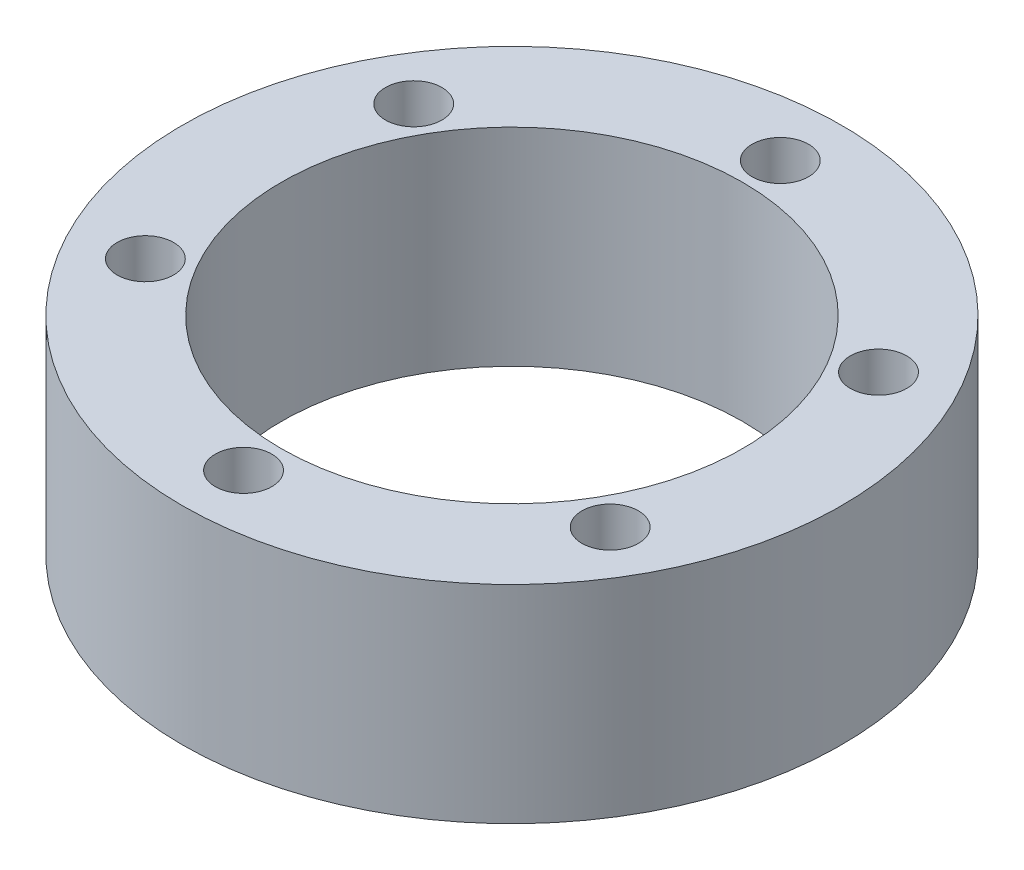
ISO-10303-21;
HEADER;
FILE_DESCRIPTION(('STEP AP214'),'2;1');
FILE_NAME('part.step','',(''),(''),'','','');
FILE_SCHEMA(('AUTOMOTIVE_DESIGN { 1 0 10303 214 1 1 1 1 }'));
ENDSEC;
DATA;
#1=APPLICATION_CONTEXT('core data for automotive mechanical design processes');
#2=APPLICATION_PROTOCOL_DEFINITION('international standard','automotive_design',2000,#1);
#3=PRODUCT_CONTEXT('',#1,'mechanical');
#4=PRODUCT('Part','Part','',(#3));
#5=PRODUCT_RELATED_PRODUCT_CATEGORY('part','',(#4));
#6=PRODUCT_DEFINITION_FORMATION('','',#4);
#7=PRODUCT_DEFINITION_CONTEXT('part definition',#1,'design');
#8=PRODUCT_DEFINITION('design','',#6,#7);
#9=PRODUCT_DEFINITION_SHAPE('','',#8);
#10=(LENGTH_UNIT() NAMED_UNIT(*) SI_UNIT(.MILLI.,.METRE.));
#11=(NAMED_UNIT(*) PLANE_ANGLE_UNIT() SI_UNIT($,.RADIAN.));
#12=(NAMED_UNIT(*) SI_UNIT($,.STERADIAN.) SOLID_ANGLE_UNIT());
#13=UNCERTAINTY_MEASURE_WITH_UNIT(LENGTH_MEASURE(1.E-05),#10,'distance_accuracy_value','');
#14=(GEOMETRIC_REPRESENTATION_CONTEXT(3) GLOBAL_UNCERTAINTY_ASSIGNED_CONTEXT((#13)) GLOBAL_UNIT_ASSIGNED_CONTEXT((#10,
#11,#12)) REPRESENTATION_CONTEXT('',''));
#15=CARTESIAN_POINT('',(0.,0.,0.));
#16=DIRECTION('',(0.,0.,1.));
#17=DIRECTION('',(1.,0.,0.));
#18=AXIS2_PLACEMENT_3D('',#15,#16,#17);
#19=CARTESIAN_POINT('',(0.,22.,0.));
#20=DIRECTION('',(0.,1.,0.));
#21=DIRECTION('',(0.,0.,1.));
#22=AXIS2_PLACEMENT_3D('',#19,#20,#21);
#23=PLANE('',#22);
#24=CARTESIAN_POINT('',(-24.6817240078541,22.,14.2500000000014));
#25=DIRECTION('',(0.,1.,0.));
#26=DIRECTION('',(0.,0.,1.));
#27=AXIS2_PLACEMENT_3D('',#24,#25,#26);
#28=CIRCLE('',#27,3.00000000000299);
#29=CARTESIAN_POINT('',(-24.6817240078541,22.,17.2500000000044));
#30=VERTEX_POINT('',#29);
#31=EDGE_CURVE('E70',#30,#30,#28,.T.);
#32=ORIENTED_EDGE('',*,*,#31,.F.);
#33=EDGE_LOOP('',(#32));
#34=FACE_BOUND('',#33,.T.);
#35=CARTESIAN_POINT('',(24.6817240078589,22.,14.2499999999986));
#36=DIRECTION('',(0.,1.,0.));
#37=DIRECTION('',(0.,0.,1.));
#38=AXIS2_PLACEMENT_3D('',#35,#36,#37);
#39=CIRCLE('',#38,3.00000000000204);
#40=CARTESIAN_POINT('',(24.6817240078589,22.,17.2500000000006));
#41=VERTEX_POINT('',#40);
#42=EDGE_CURVE('E58',#41,#41,#39,.T.);
#43=ORIENTED_EDGE('',*,*,#42,.F.);
#44=EDGE_LOOP('',(#43));
#45=FACE_BOUND('',#44,.T.);
#46=CARTESIAN_POINT('',(0.,22.,-28.5));
#47=DIRECTION('',(0.,1.,0.));
#48=DIRECTION('',(0.,0.,1.));
#49=AXIS2_PLACEMENT_3D('',#46,#47,#48);
#50=CIRCLE('',#49,3.);
#51=CARTESIAN_POINT('',(0.,22.,-25.5));
#52=VERTEX_POINT('',#51);
#53=EDGE_CURVE('E46',#52,#52,#50,.T.);
#54=ORIENTED_EDGE('',*,*,#53,.F.);
#55=EDGE_LOOP('',(#54));
#56=FACE_BOUND('',#55,.T.);
#57=CARTESIAN_POINT('',(0.,22.,0.));
#58=DIRECTION('',(0.,1.,0.));
#59=DIRECTION('',(0.,0.,1.));
#60=AXIS2_PLACEMENT_3D('',#57,#58,#59);
#61=CIRCLE('',#60,35.);
#62=CARTESIAN_POINT('',(0.,22.,35.));
#63=VERTEX_POINT('',#62);
#64=EDGE_CURVE('E10',#63,#63,#61,.T.);
#65=ORIENTED_EDGE('',*,*,#64,.T.);
#66=EDGE_LOOP('',(#65));
#67=FACE_BOUND('',#66,.T.);
#68=CARTESIAN_POINT('',(0.,22.,0.));
#69=DIRECTION('',(0.,1.,0.));
#70=DIRECTION('',(0.,0.,1.));
#71=AXIS2_PLACEMENT_3D('',#68,#69,#70);
#72=CIRCLE('',#71,24.5);
#73=CARTESIAN_POINT('',(0.,22.,24.5));
#74=VERTEX_POINT('',#73);
#75=EDGE_CURVE('E41',#74,#74,#72,.T.);
#76=ORIENTED_EDGE('',*,*,#75,.F.);
#77=EDGE_LOOP('',(#76));
#78=FACE_BOUND('',#77,.T.);
#79=CARTESIAN_POINT('',(24.6817240078573,22.,-14.2500000000014));
#80=DIRECTION('',(0.,1.,0.));
#81=DIRECTION('',(0.,0.,1.));
#82=AXIS2_PLACEMENT_3D('',#79,#80,#81);
#83=CIRCLE('',#82,3.00000000000043);
#84=CARTESIAN_POINT('',(24.6817240078573,22.,-11.250000000001));
#85=VERTEX_POINT('',#84);
#86=EDGE_CURVE('E52',#85,#85,#83,.T.);
#87=ORIENTED_EDGE('',*,*,#86,.F.);
#88=EDGE_LOOP('',(#87));
#89=FACE_BOUND('',#88,.T.);
#90=CARTESIAN_POINT('',(3.23309438831092E-12,22.,28.5));
#91=DIRECTION('',(0.,1.,0.));
#92=DIRECTION('',(0.,0.,1.));
#93=AXIS2_PLACEMENT_3D('',#90,#91,#92);
#94=CIRCLE('',#93,3.00000000000328);
#95=CARTESIAN_POINT('',(3.23309438831092E-12,22.,31.5000000000033));
#96=VERTEX_POINT('',#95);
#97=EDGE_CURVE('E64',#96,#96,#94,.T.);
#98=ORIENTED_EDGE('',*,*,#97,.F.);
#99=EDGE_LOOP('',(#98));
#100=FACE_BOUND('',#99,.T.);
#101=CARTESIAN_POINT('',(-24.6817240078557,22.,-14.2499999999986));
#102=DIRECTION('',(0.,1.,0.));
#103=DIRECTION('',(0.,0.,1.));
#104=AXIS2_PLACEMENT_3D('',#101,#102,#103);
#105=CIRCLE('',#104,3.00000000000152);
#106=CARTESIAN_POINT('',(-24.6817240078557,22.,-11.2499999999971));
#107=VERTEX_POINT('',#106);
#108=EDGE_CURVE('E76',#107,#107,#105,.T.);
#109=ORIENTED_EDGE('',*,*,#108,.F.);
#110=EDGE_LOOP('',(#109));
#111=FACE_BOUND('',#110,.T.);
#112=ADVANCED_FACE('F30',(#34,#45,#56,#67,#78,#89,#100,#111),#23,.T.);
#113=CARTESIAN_POINT('',(0.,0.,0.));
#114=DIRECTION('',(0.,1.,0.));
#115=DIRECTION('',(0.,0.,1.));
#116=AXIS2_PLACEMENT_3D('',#113,#114,#115);
#117=PLANE('',#116);
#118=CARTESIAN_POINT('',(-24.6817240078541,0.,14.2500000000014));
#119=DIRECTION('',(0.,1.,0.));
#120=DIRECTION('',(0.,0.,1.));
#121=AXIS2_PLACEMENT_3D('',#118,#119,#120);
#122=CIRCLE('',#121,3.00000000000299);
#123=CARTESIAN_POINT('',(-24.6817240078541,0.,17.2500000000044));
#124=VERTEX_POINT('',#123);
#125=EDGE_CURVE('E73',#124,#124,#122,.T.);
#126=ORIENTED_EDGE('',*,*,#125,.T.);
#127=EDGE_LOOP('',(#126));
#128=FACE_BOUND('',#127,.T.);
#129=CARTESIAN_POINT('',(24.6817240078589,0.,14.2499999999986));
#130=DIRECTION('',(0.,1.,0.));
#131=DIRECTION('',(0.,0.,1.));
#132=AXIS2_PLACEMENT_3D('',#129,#130,#131);
#133=CIRCLE('',#132,3.00000000000204);
#134=CARTESIAN_POINT('',(24.6817240078589,0.,17.2500000000006));
#135=VERTEX_POINT('',#134);
#136=EDGE_CURVE('E61',#135,#135,#133,.T.);
#137=ORIENTED_EDGE('',*,*,#136,.T.);
#138=EDGE_LOOP('',(#137));
#139=FACE_BOUND('',#138,.T.);
#140=CARTESIAN_POINT('',(0.,0.,-28.5));
#141=DIRECTION('',(0.,1.,0.));
#142=DIRECTION('',(0.,0.,1.));
#143=AXIS2_PLACEMENT_3D('',#140,#141,#142);
#144=CIRCLE('',#143,3.);
#145=CARTESIAN_POINT('',(0.,0.,-25.5));
#146=VERTEX_POINT('',#145);
#147=EDGE_CURVE('E49',#146,#146,#144,.T.);
#148=ORIENTED_EDGE('',*,*,#147,.T.);
#149=EDGE_LOOP('',(#148));
#150=FACE_BOUND('',#149,.T.);
#151=CARTESIAN_POINT('',(0.,0.,0.));
#152=DIRECTION('',(0.,1.,0.));
#153=DIRECTION('',(0.,0.,1.));
#154=AXIS2_PLACEMENT_3D('',#151,#152,#153);
#155=CIRCLE('',#154,35.);
#156=CARTESIAN_POINT('',(0.,0.,35.));
#157=VERTEX_POINT('',#156);
#158=EDGE_CURVE('E34',#157,#157,#155,.T.);
#159=ORIENTED_EDGE('',*,*,#158,.F.);
#160=EDGE_LOOP('',(#159));
#161=FACE_BOUND('',#160,.T.);
#162=CARTESIAN_POINT('',(0.,0.,0.));
#163=DIRECTION('',(0.,1.,0.));
#164=DIRECTION('',(0.,0.,1.));
#165=AXIS2_PLACEMENT_3D('',#162,#163,#164);
#166=CIRCLE('',#165,24.5);
#167=CARTESIAN_POINT('',(0.,0.,24.5));
#168=VERTEX_POINT('',#167);
#169=EDGE_CURVE('E43',#168,#168,#166,.T.);
#170=ORIENTED_EDGE('',*,*,#169,.T.);
#171=EDGE_LOOP('',(#170));
#172=FACE_BOUND('',#171,.T.);
#173=CARTESIAN_POINT('',(24.6817240078573,0.,-14.2500000000014));
#174=DIRECTION('',(0.,1.,0.));
#175=DIRECTION('',(0.,0.,1.));
#176=AXIS2_PLACEMENT_3D('',#173,#174,#175);
#177=CIRCLE('',#176,3.00000000000043);
#178=CARTESIAN_POINT('',(24.6817240078573,0.,-11.250000000001));
#179=VERTEX_POINT('',#178);
#180=EDGE_CURVE('E55',#179,#179,#177,.T.);
#181=ORIENTED_EDGE('',*,*,#180,.T.);
#182=EDGE_LOOP('',(#181));
#183=FACE_BOUND('',#182,.T.);
#184=CARTESIAN_POINT('',(3.23309438831092E-12,0.,28.5));
#185=DIRECTION('',(0.,1.,0.));
#186=DIRECTION('',(0.,0.,1.));
#187=AXIS2_PLACEMENT_3D('',#184,#185,#186);
#188=CIRCLE('',#187,3.00000000000328);
#189=CARTESIAN_POINT('',(3.23309438831092E-12,0.,31.5000000000033));
#190=VERTEX_POINT('',#189);
#191=EDGE_CURVE('E67',#190,#190,#188,.T.);
#192=ORIENTED_EDGE('',*,*,#191,.T.);
#193=EDGE_LOOP('',(#192));
#194=FACE_BOUND('',#193,.T.);
#195=CARTESIAN_POINT('',(-24.6817240078557,0.,-14.2499999999986));
#196=DIRECTION('',(0.,1.,0.));
#197=DIRECTION('',(0.,0.,1.));
#198=AXIS2_PLACEMENT_3D('',#195,#196,#197);
#199=CIRCLE('',#198,3.00000000000152);
#200=CARTESIAN_POINT('',(-24.6817240078557,0.,-11.2499999999971));
#201=VERTEX_POINT('',#200);
#202=EDGE_CURVE('E79',#201,#201,#199,.T.);
#203=ORIENTED_EDGE('',*,*,#202,.T.);
#204=EDGE_LOOP('',(#203));
#205=FACE_BOUND('',#204,.T.);
#206=ADVANCED_FACE('F89',(#128,#139,#150,#161,#172,#183,#194,#205),#117,.F.);
#207=CARTESIAN_POINT('',(0.,22.,0.));
#208=DIRECTION('',(0.,-1.,0.));
#209=DIRECTION('',(0.,0.,-1.));
#210=AXIS2_PLACEMENT_3D('',#207,#208,#209);
#211=CYLINDRICAL_SURFACE('',#210,35.);
#212=ORIENTED_EDGE('',*,*,#64,.F.);
#213=EDGE_LOOP('',(#212));
#214=FACE_BOUND('',#213,.T.);
#215=ORIENTED_EDGE('',*,*,#158,.T.);
#216=EDGE_LOOP('',(#215));
#217=FACE_BOUND('',#216,.T.);
#218=ADVANCED_FACE('F32',(#214,#217),#211,.T.);
#219=CARTESIAN_POINT('',(0.,22.,0.));
#220=DIRECTION('',(0.,-1.,0.));
#221=DIRECTION('',(0.,0.,-1.));
#222=AXIS2_PLACEMENT_3D('',#219,#220,#221);
#223=CYLINDRICAL_SURFACE('',#222,24.5);
#224=ORIENTED_EDGE('',*,*,#75,.T.);
#225=EDGE_LOOP('',(#224));
#226=FACE_BOUND('',#225,.T.);
#227=ORIENTED_EDGE('',*,*,#169,.F.);
#228=EDGE_LOOP('',(#227));
#229=FACE_BOUND('',#228,.T.);
#230=ADVANCED_FACE('F99',(#226,#229),#223,.F.);
#231=CARTESIAN_POINT('',(0.,22.,-28.5));
#232=DIRECTION('',(0.,-1.,0.));
#233=DIRECTION('',(0.,0.,-1.));
#234=AXIS2_PLACEMENT_3D('',#231,#232,#233);
#235=CYLINDRICAL_SURFACE('',#234,3.);
#236=ORIENTED_EDGE('',*,*,#53,.T.);
#237=EDGE_LOOP('',(#236));
#238=FACE_BOUND('',#237,.T.);
#239=ORIENTED_EDGE('',*,*,#147,.F.);
#240=EDGE_LOOP('',(#239));
#241=FACE_BOUND('',#240,.T.);
#242=ADVANCED_FACE('F102',(#238,#241),#235,.F.);
#243=CARTESIAN_POINT('',(24.6817240078573,22.,-14.2500000000014));
#244=DIRECTION('',(0.,-1.,0.));
#245=DIRECTION('',(0.,0.,-1.));
#246=AXIS2_PLACEMENT_3D('',#243,#244,#245);
#247=CYLINDRICAL_SURFACE('',#246,3.00000000000043);
#248=ORIENTED_EDGE('',*,*,#86,.T.);
#249=EDGE_LOOP('',(#248));
#250=FACE_BOUND('',#249,.T.);
#251=ORIENTED_EDGE('',*,*,#180,.F.);
#252=EDGE_LOOP('',(#251));
#253=FACE_BOUND('',#252,.T.);
#254=ADVANCED_FACE('F106',(#250,#253),#247,.F.);
#255=CARTESIAN_POINT('',(24.6817240078589,22.,14.2499999999986));
#256=DIRECTION('',(0.,-1.,0.));
#257=DIRECTION('',(0.,0.,-1.));
#258=AXIS2_PLACEMENT_3D('',#255,#256,#257);
#259=CYLINDRICAL_SURFACE('',#258,3.00000000000204);
#260=ORIENTED_EDGE('',*,*,#42,.T.);
#261=EDGE_LOOP('',(#260));
#262=FACE_BOUND('',#261,.T.);
#263=ORIENTED_EDGE('',*,*,#136,.F.);
#264=EDGE_LOOP('',(#263));
#265=FACE_BOUND('',#264,.T.);
#266=ADVANCED_FACE('F110',(#262,#265),#259,.F.);
#267=CARTESIAN_POINT('',(3.23309438831092E-12,22.,28.5));
#268=DIRECTION('',(0.,-1.,0.));
#269=DIRECTION('',(0.,0.,-1.));
#270=AXIS2_PLACEMENT_3D('',#267,#268,#269);
#271=CYLINDRICAL_SURFACE('',#270,3.00000000000328);
#272=ORIENTED_EDGE('',*,*,#97,.T.);
#273=EDGE_LOOP('',(#272));
#274=FACE_BOUND('',#273,.T.);
#275=ORIENTED_EDGE('',*,*,#191,.F.);
#276=EDGE_LOOP('',(#275));
#277=FACE_BOUND('',#276,.T.);
#278=ADVANCED_FACE('F114',(#274,#277),#271,.F.);
#279=CARTESIAN_POINT('',(-24.6817240078541,22.,14.2500000000014));
#280=DIRECTION('',(0.,-1.,0.));
#281=DIRECTION('',(0.,0.,-1.));
#282=AXIS2_PLACEMENT_3D('',#279,#280,#281);
#283=CYLINDRICAL_SURFACE('',#282,3.00000000000299);
#284=ORIENTED_EDGE('',*,*,#31,.T.);
#285=EDGE_LOOP('',(#284));
#286=FACE_BOUND('',#285,.T.);
#287=ORIENTED_EDGE('',*,*,#125,.F.);
#288=EDGE_LOOP('',(#287));
#289=FACE_BOUND('',#288,.T.);
#290=ADVANCED_FACE('F118',(#286,#289),#283,.F.);
#291=CARTESIAN_POINT('',(-24.6817240078557,22.,-14.2499999999986));
#292=DIRECTION('',(0.,-1.,0.));
#293=DIRECTION('',(0.,0.,-1.));
#294=AXIS2_PLACEMENT_3D('',#291,#292,#293);
#295=CYLINDRICAL_SURFACE('',#294,3.00000000000152);
#296=ORIENTED_EDGE('',*,*,#108,.T.);
#297=EDGE_LOOP('',(#296));
#298=FACE_BOUND('',#297,.T.);
#299=ORIENTED_EDGE('',*,*,#202,.F.);
#300=EDGE_LOOP('',(#299));
#301=FACE_BOUND('',#300,.T.);
#302=ADVANCED_FACE('F85',(#298,#301),#295,.F.);
#303=CLOSED_SHELL('',(#112,#206,#218,#230,#242,#254,#266,#278,#290,#302));
#304=MANIFOLD_SOLID_BREP('B2',#303);
#305=ADVANCED_BREP_SHAPE_REPRESENTATION('',(#18,#304),#14);
#306=SHAPE_DEFINITION_REPRESENTATION(#9,#305);
ENDSEC;
END-ISO-10303-21;
